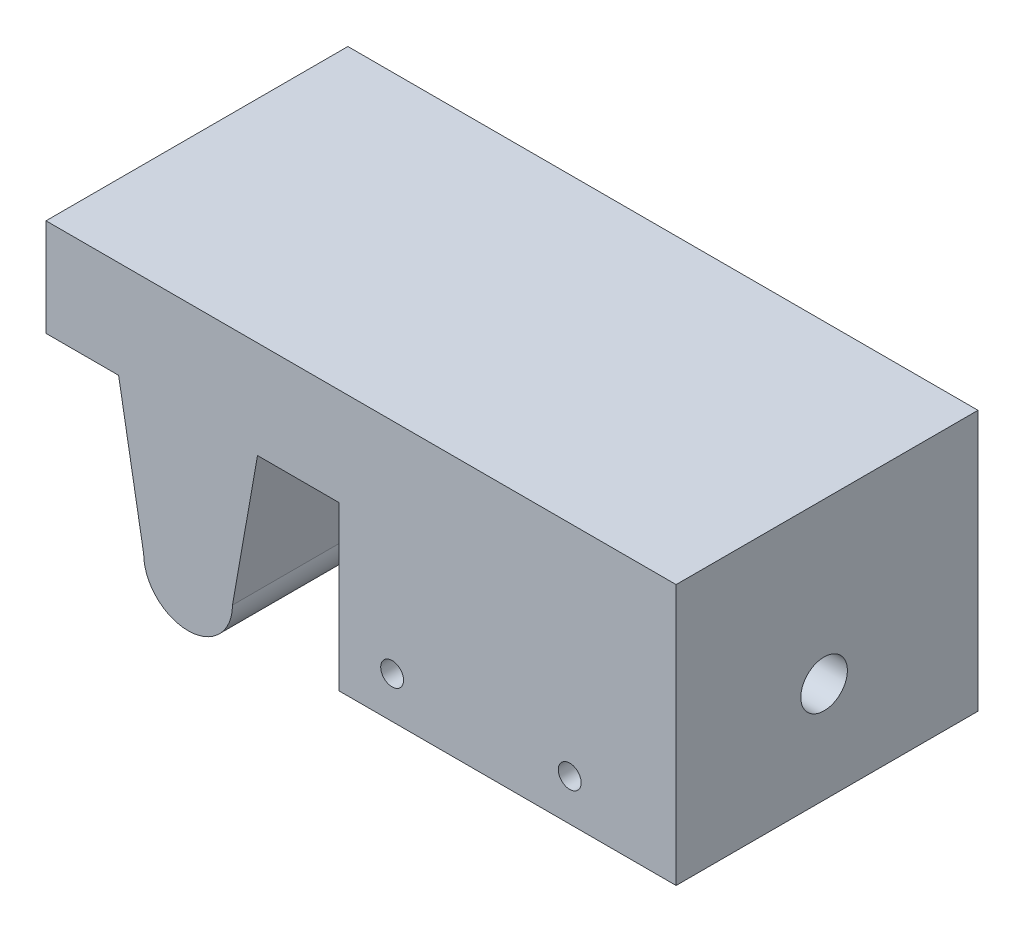
ISO-10303-21;
HEADER;
FILE_DESCRIPTION(('STEP AP214'),'2;1');
FILE_NAME('part.step','',(''),(''),'','','');
FILE_SCHEMA(('AUTOMOTIVE_DESIGN { 1 0 10303 214 1 1 1 1 }'));
ENDSEC;
DATA;
#1=APPLICATION_CONTEXT('core data for automotive mechanical design processes');
#2=APPLICATION_PROTOCOL_DEFINITION('international standard','automotive_design',2000,#1);
#3=PRODUCT_CONTEXT('',#1,'mechanical');
#4=PRODUCT('Part','Part','',(#3));
#5=PRODUCT_RELATED_PRODUCT_CATEGORY('part','',(#4));
#6=PRODUCT_DEFINITION_FORMATION('','',#4);
#7=PRODUCT_DEFINITION_CONTEXT('part definition',#1,'design');
#8=PRODUCT_DEFINITION('design','',#6,#7);
#9=PRODUCT_DEFINITION_SHAPE('','',#8);
#10=(LENGTH_UNIT() NAMED_UNIT(*) SI_UNIT(.MILLI.,.METRE.));
#11=(NAMED_UNIT(*) PLANE_ANGLE_UNIT() SI_UNIT($,.RADIAN.));
#12=(NAMED_UNIT(*) SI_UNIT($,.STERADIAN.) SOLID_ANGLE_UNIT());
#13=UNCERTAINTY_MEASURE_WITH_UNIT(LENGTH_MEASURE(1.E-05),#10,'distance_accuracy_value','');
#14=(GEOMETRIC_REPRESENTATION_CONTEXT(3) GLOBAL_UNCERTAINTY_ASSIGNED_CONTEXT((#13)) GLOBAL_UNIT_ASSIGNED_CONTEXT((#10,
#11,#12)) REPRESENTATION_CONTEXT('',''));
#15=CARTESIAN_POINT('',(0.,0.,0.));
#16=DIRECTION('',(0.,0.,1.));
#17=DIRECTION('',(1.,0.,0.));
#18=AXIS2_PLACEMENT_3D('',#15,#16,#17);
#19=CARTESIAN_POINT('',(48.,-5.616325,33.1917878));
#20=DIRECTION('',(0.,-1.,0.));
#21=DIRECTION('',(0.,0.,1.));
#22=AXIS2_PLACEMENT_3D('',#19,#20,#21);
#23=PLANE('',#22);
#24=DIRECTION('',(-1.,0.,0.));
#25=VECTOR('',#24,1.);
#26=CARTESIAN_POINT('',(12.2681524629967,-5.616325,55.1917878));
#27=LINE('',#26,#25);
#28=CARTESIAN_POINT('',(35.7318475370033,-5.616325,55.1917878));
#29=VERTEX_POINT('',#28);
#30=CARTESIAN_POINT('',(12.2681524629967,-5.616325,55.1917878));
#31=VERTEX_POINT('',#30);
#32=EDGE_CURVE('E155',#29,#31,#27,.T.);
#33=ORIENTED_EDGE('',*,*,#32,.T.);
#34=DIRECTION('',(0.,0.,-1.));
#35=VECTOR('',#34,1.);
#36=CARTESIAN_POINT('',(12.2681524629967,-5.616325,123.470216823141));
#37=LINE('',#36,#35);
#38=CARTESIAN_POINT('',(12.2681524629967,-5.616325,84.1917878));
#39=VERTEX_POINT('',#38);
#40=EDGE_CURVE('E151',#39,#31,#37,.T.);
#41=ORIENTED_EDGE('',*,*,#40,.F.);
#42=DIRECTION('',(1.,0.,0.));
#43=VECTOR('',#42,1.);
#44=CARTESIAN_POINT('',(-17.2191805697573,-5.616325,84.1917878));
#45=LINE('',#44,#43);
#46=CARTESIAN_POINT('',(0.,-5.616325,84.1917878));
#47=VERTEX_POINT('',#46);
#48=EDGE_CURVE('E190',#47,#39,#45,.T.);
#49=ORIENTED_EDGE('',*,*,#48,.F.);
#50=DIRECTION('',(0.,0.,1.));
#51=VECTOR('',#50,1.);
#52=CARTESIAN_POINT('',(0.,-5.616325,33.1917878));
#53=LINE('',#52,#51);
#54=CARTESIAN_POINT('',(0.,-5.616325,33.1917878));
#55=VERTEX_POINT('',#54);
#56=EDGE_CURVE('E56',#55,#47,#53,.T.);
#57=ORIENTED_EDGE('',*,*,#56,.F.);
#58=DIRECTION('',(-1.,0.,0.));
#59=VECTOR('',#58,1.);
#60=CARTESIAN_POINT('',(49.5,-5.616325,33.1917878));
#61=LINE('',#60,#59);
#62=CARTESIAN_POINT('',(49.5,-5.616325,33.1917878));
#63=VERTEX_POINT('',#62);
#64=EDGE_CURVE('E167',#63,#55,#61,.T.);
#65=ORIENTED_EDGE('',*,*,#64,.F.);
#66=DIRECTION('',(0.,0.,1.));
#67=VECTOR('',#66,1.);
#68=CARTESIAN_POINT('',(49.5,-5.616325,33.1917878));
#69=LINE('',#68,#67);
#70=CARTESIAN_POINT('',(49.5,-5.616325,84.1917878));
#71=VERTEX_POINT('',#70);
#72=EDGE_CURVE('E169',#63,#71,#69,.T.);
#73=ORIENTED_EDGE('',*,*,#72,.T.);
#74=CARTESIAN_POINT('',(35.7318475370033,-5.616325,84.1917878));
#75=VERTEX_POINT('',#74);
#76=EDGE_CURVE('E189',#75,#71,#45,.T.);
#77=ORIENTED_EDGE('',*,*,#76,.F.);
#78=DIRECTION('',(0.,0.,-1.));
#79=VECTOR('',#78,1.);
#80=CARTESIAN_POINT('',(35.7318475370033,-5.616325,123.470216823141));
#81=LINE('',#80,#79);
#82=EDGE_CURVE('E48',#75,#29,#81,.T.);
#83=ORIENTED_EDGE('',*,*,#82,.T.);
#84=EDGE_LOOP('',(#33,#41,#49,#57,#65,#73,#77,#83));
#85=FACE_BOUND('',#84,.T.);
#86=ADVANCED_FACE('F33',(#85),#23,.T.);
#87=CARTESIAN_POINT('',(0.,-8.166325,0.));
#88=DIRECTION('',(0.,1.,0.));
#89=DIRECTION('',(0.,0.,1.));
#90=AXIS2_PLACEMENT_3D('',#87,#88,#89);
#91=PLANE('',#90);
#92=DIRECTION('',(0.,0.,-1.));
#93=VECTOR('',#92,1.);
#94=CARTESIAN_POINT('',(49.5,-8.166325,-60.3469004731473));
#95=LINE('',#94,#93);
#96=CARTESIAN_POINT('',(49.5,-8.166325,76.1917878));
#97=VERTEX_POINT('',#96);
#98=CARTESIAN_POINT('',(49.5,-8.166325,33.1917878));
#99=VERTEX_POINT('',#98);
#100=EDGE_CURVE('E245',#97,#99,#95,.T.);
#101=ORIENTED_EDGE('',*,*,#100,.T.);
#102=DIRECTION('',(1.,0.,0.));
#103=VECTOR('',#102,1.);
#104=CARTESIAN_POINT('',(0.,-8.166325,33.1917878));
#105=LINE('',#104,#103);
#106=CARTESIAN_POINT('',(97.45,-8.166325,33.1917878));
#107=VERTEX_POINT('',#106);
#108=EDGE_CURVE('E186',#99,#107,#105,.T.);
#109=ORIENTED_EDGE('',*,*,#108,.T.);
#110=DIRECTION('',(0.,0.,-1.));
#111=VECTOR('',#110,1.);
#112=CARTESIAN_POINT('',(97.45,-8.166325,-9.80821219999999));
#113=LINE('',#112,#111);
#114=CARTESIAN_POINT('',(97.45,-8.166325,76.1917878));
#115=VERTEX_POINT('',#114);
#116=EDGE_CURVE('E232',#115,#107,#113,.T.);
#117=ORIENTED_EDGE('',*,*,#116,.F.);
#118=DIRECTION('',(-1.,0.,0.));
#119=VECTOR('',#118,1.);
#120=CARTESIAN_POINT('',(49.5,-8.166325,76.1917878));
#121=LINE('',#120,#119);
#122=EDGE_CURVE('E217',#115,#97,#121,.T.);
#123=ORIENTED_EDGE('',*,*,#122,.T.);
#124=EDGE_LOOP('',(#101,#109,#117,#123));
#125=FACE_BOUND('',#124,.T.);
#126=ADVANCED_FACE('F280',(#125),#91,.F.);
#127=CARTESIAN_POINT('',(0.,0.,10.));
#128=DIRECTION('',(1.,0.,0.));
#129=DIRECTION('',(0.,0.,-1.));
#130=AXIS2_PLACEMENT_3D('',#127,#128,#129);
#131=PLANE('',#130);
#132=DIRECTION('',(0.,1.,0.));
#133=VECTOR('',#132,1.);
#134=CARTESIAN_POINT('',(0.,10.8609375,33.1917878));
#135=LINE('',#134,#133);
#136=CARTESIAN_POINT('',(0.,10.8609375,33.1917878));
#137=VERTEX_POINT('',#136);
#138=EDGE_CURVE('E175',#55,#137,#135,.T.);
#139=ORIENTED_EDGE('',*,*,#138,.F.);
#140=ORIENTED_EDGE('',*,*,#56,.T.);
#141=DIRECTION('',(0.,1.,0.));
#142=VECTOR('',#141,1.);
#143=CARTESIAN_POINT('',(0.,10.8609375,84.1917878));
#144=LINE('',#143,#142);
#145=CARTESIAN_POINT('',(0.,10.8609375,84.1917878));
#146=VERTEX_POINT('',#145);
#147=EDGE_CURVE('E194',#47,#146,#144,.T.);
#148=ORIENTED_EDGE('',*,*,#147,.T.);
#149=DIRECTION('',(0.,0.,-1.));
#150=VECTOR('',#149,1.);
#151=CARTESIAN_POINT('',(0.,10.8609375,82.405200233796));
#152=LINE('',#151,#150);
#153=EDGE_CURVE('E242',#146,#137,#152,.T.);
#154=ORIENTED_EDGE('',*,*,#153,.T.);
#155=EDGE_LOOP('',(#139,#140,#148,#154));
#156=FACE_BOUND('',#155,.T.);
#157=ADVANCED_FACE('F35',(#156),#131,.F.);
#158=CARTESIAN_POINT('',(0.,10.8609375,82.405200233796));
#159=DIRECTION('',(0.,-1.,0.));
#160=DIRECTION('',(0.,0.,-1.));
#161=AXIS2_PLACEMENT_3D('',#158,#159,#160);
#162=PLANE('',#161);
#163=DIRECTION('',(0.,0.,1.));
#164=VECTOR('',#163,1.);
#165=CARTESIAN_POINT('',(106.45,10.8609375,33.1917878));
#166=LINE('',#165,#164);
#167=CARTESIAN_POINT('',(106.45,10.8609375,33.1917878));
#168=VERTEX_POINT('',#167);
#169=CARTESIAN_POINT('',(106.45,10.8609375,84.1917878));
#170=VERTEX_POINT('',#169);
#171=EDGE_CURVE('E238',#168,#170,#166,.T.);
#172=ORIENTED_EDGE('',*,*,#171,.F.);
#173=DIRECTION('',(-1.,0.,0.));
#174=VECTOR('',#173,1.);
#175=CARTESIAN_POINT('',(106.45,10.8609375,33.1917878));
#176=LINE('',#175,#174);
#177=EDGE_CURVE('E179',#168,#137,#176,.T.);
#178=ORIENTED_EDGE('',*,*,#177,.T.);
#179=ORIENTED_EDGE('',*,*,#153,.F.);
#180=DIRECTION('',(1.,0.,0.));
#181=VECTOR('',#180,1.);
#182=CARTESIAN_POINT('',(-17.2191805697573,10.8609375,84.1917878));
#183=LINE('',#182,#181);
#184=EDGE_CURVE('E203',#146,#170,#183,.T.);
#185=ORIENTED_EDGE('',*,*,#184,.T.);
#186=EDGE_LOOP('',(#172,#178,#179,#185));
#187=FACE_BOUND('',#186,.T.);
#188=ADVANCED_FACE('F264',(#187),#162,.F.);
#189=CARTESIAN_POINT('',(106.45,0.,0.));
#190=DIRECTION('',(-1.,0.,0.));
#191=DIRECTION('',(0.,0.,1.));
#192=AXIS2_PLACEMENT_3D('',#189,#190,#191);
#193=PLANE('',#192);
#194=CARTESIAN_POINT('',(106.45,-16.166325,59.1917878));
#195=DIRECTION('',(-1.,0.,0.));
#196=DIRECTION('',(0.,0.,1.));
#197=AXIS2_PLACEMENT_3D('',#194,#195,#196);
#198=CIRCLE('',#197,3.93700000000001);
#199=CARTESIAN_POINT('',(106.45,-16.166325,63.1287878));
#200=VERTEX_POINT('',#199);
#201=EDGE_CURVE('E142',#200,#200,#198,.T.);
#202=ORIENTED_EDGE('',*,*,#201,.T.);
#203=EDGE_LOOP('',(#202));
#204=FACE_BOUND('',#203,.T.);
#205=DIRECTION('',(0.,0.,1.));
#206=VECTOR('',#205,1.);
#207=CARTESIAN_POINT('',(106.45,-33.166325,-17.8082122));
#208=LINE('',#207,#206);
#209=CARTESIAN_POINT('',(106.45,-33.166325,33.1917878));
#210=VERTEX_POINT('',#209);
#211=CARTESIAN_POINT('',(106.45,-33.166325,84.1917878));
#212=VERTEX_POINT('',#211);
#213=EDGE_CURVE('E233',#210,#212,#208,.T.);
#214=ORIENTED_EDGE('',*,*,#213,.F.);
#215=DIRECTION('',(0.,1.,0.));
#216=VECTOR('',#215,1.);
#217=CARTESIAN_POINT('',(106.45,10.8609375,33.1917878));
#218=LINE('',#217,#216);
#219=EDGE_CURVE('E176',#210,#168,#218,.T.);
#220=ORIENTED_EDGE('',*,*,#219,.T.);
#221=ORIENTED_EDGE('',*,*,#171,.T.);
#222=DIRECTION('',(0.,1.,0.));
#223=VECTOR('',#222,1.);
#224=CARTESIAN_POINT('',(106.45,-8.166325,84.1917878));
#225=LINE('',#224,#223);
#226=EDGE_CURVE('E206',#212,#170,#225,.T.);
#227=ORIENTED_EDGE('',*,*,#226,.F.);
#228=EDGE_LOOP('',(#214,#220,#221,#227));
#229=FACE_BOUND('',#228,.T.);
#230=ADVANCED_FACE('F256',(#204,#229),#193,.F.);
#231=CARTESIAN_POINT('',(97.45,-33.166325,-9.80821219999999));
#232=DIRECTION('',(1.,0.,0.));
#233=DIRECTION('',(0.,0.,-1.));
#234=AXIS2_PLACEMENT_3D('',#231,#232,#233);
#235=PLANE('',#234);
#236=CARTESIAN_POINT('',(97.45,-16.166325,59.1917878));
#237=DIRECTION('',(-1.,0.,0.));
#238=DIRECTION('',(0.,0.,1.));
#239=AXIS2_PLACEMENT_3D('',#236,#237,#238);
#240=CIRCLE('',#239,3.93700000000001);
#241=CARTESIAN_POINT('',(97.45,-16.166325,63.1287878));
#242=VERTEX_POINT('',#241);
#243=EDGE_CURVE('E305',#242,#242,#240,.T.);
#244=ORIENTED_EDGE('',*,*,#243,.F.);
#245=EDGE_LOOP('',(#244));
#246=FACE_BOUND('',#245,.T.);
#247=ORIENTED_EDGE('',*,*,#116,.T.);
#248=DIRECTION('',(0.,-1.,0.));
#249=VECTOR('',#248,1.);
#250=CARTESIAN_POINT('',(97.45,-33.166325,33.1917878));
#251=LINE('',#250,#249);
#252=CARTESIAN_POINT('',(97.45,-33.166325,33.1917878));
#253=VERTEX_POINT('',#252);
#254=EDGE_CURVE('E183',#107,#253,#251,.T.);
#255=ORIENTED_EDGE('',*,*,#254,.T.);
#256=DIRECTION('',(0.,0.,-1.));
#257=VECTOR('',#256,1.);
#258=CARTESIAN_POINT('',(97.45,-33.166325,-9.80821219999999));
#259=LINE('',#258,#257);
#260=CARTESIAN_POINT('',(97.45,-33.166325,76.1917878));
#261=VERTEX_POINT('',#260);
#262=EDGE_CURVE('E235',#261,#253,#259,.T.);
#263=ORIENTED_EDGE('',*,*,#262,.F.);
#264=DIRECTION('',(0.,1.,0.));
#265=VECTOR('',#264,1.);
#266=CARTESIAN_POINT('',(97.45,-33.166325,76.1917878));
#267=LINE('',#266,#265);
#268=EDGE_CURVE('E229',#261,#115,#267,.T.);
#269=ORIENTED_EDGE('',*,*,#268,.T.);
#270=EDGE_LOOP('',(#247,#255,#263,#269));
#271=FACE_BOUND('',#270,.T.);
#272=ADVANCED_FACE('F276',(#246,#271),#235,.F.);
#273=CARTESIAN_POINT('',(0.,-33.166325,0.));
#274=DIRECTION('',(0.,1.,0.));
#275=DIRECTION('',(0.,0.,1.));
#276=AXIS2_PLACEMENT_3D('',#273,#274,#275);
#277=PLANE('',#276);
#278=ORIENTED_EDGE('',*,*,#262,.T.);
#279=DIRECTION('',(1.,0.,0.));
#280=VECTOR('',#279,1.);
#281=CARTESIAN_POINT('',(0.,-33.166325,33.1917878));
#282=LINE('',#281,#280);
#283=EDGE_CURVE('E41',#253,#210,#282,.T.);
#284=ORIENTED_EDGE('',*,*,#283,.T.);
#285=ORIENTED_EDGE('',*,*,#213,.T.);
#286=DIRECTION('',(1.,0.,0.));
#287=VECTOR('',#286,1.);
#288=CARTESIAN_POINT('',(49.5,-33.166325,84.1917878));
#289=LINE('',#288,#287);
#290=CARTESIAN_POINT('',(49.5,-33.166325,84.1917878));
#291=VERTEX_POINT('',#290);
#292=EDGE_CURVE('E209',#291,#212,#289,.T.);
#293=ORIENTED_EDGE('',*,*,#292,.F.);
#294=DIRECTION('',(0.,0.,1.));
#295=VECTOR('',#294,1.);
#296=CARTESIAN_POINT('',(49.5,-33.166325,84.1917878));
#297=LINE('',#296,#295);
#298=CARTESIAN_POINT('',(49.5,-33.166325,76.1917878));
#299=VERTEX_POINT('',#298);
#300=EDGE_CURVE('E215',#299,#291,#297,.T.);
#301=ORIENTED_EDGE('',*,*,#300,.F.);
#302=DIRECTION('',(-1.,0.,0.));
#303=VECTOR('',#302,1.);
#304=CARTESIAN_POINT('',(49.5,-33.166325,76.1917878));
#305=LINE('',#304,#303);
#306=EDGE_CURVE('E226',#261,#299,#305,.T.);
#307=ORIENTED_EDGE('',*,*,#306,.F.);
#308=EDGE_LOOP('',(#278,#284,#285,#293,#301,#307));
#309=FACE_BOUND('',#308,.T.);
#310=ADVANCED_FACE('F250',(#309),#277,.F.);
#311=CARTESIAN_POINT('',(88.475,-26.166325,84.1917878));
#312=DIRECTION('',(0.,0.,-1.));
#313=DIRECTION('',(1.,0.,0.));
#314=AXIS2_PLACEMENT_3D('',#311,#312,#313);
#315=CYLINDRICAL_SURFACE('',#314,1.9304);
#316=CARTESIAN_POINT('',(88.475,-26.166325,84.1917878));
#317=DIRECTION('',(0.,0.,1.));
#318=DIRECTION('',(1.,0.,0.));
#319=AXIS2_PLACEMENT_3D('',#316,#317,#318);
#320=CIRCLE('',#319,1.9304);
#321=CARTESIAN_POINT('',(90.4054,-26.166325,84.1917878));
#322=VERTEX_POINT('',#321);
#323=EDGE_CURVE('E200',#322,#322,#320,.T.);
#324=ORIENTED_EDGE('',*,*,#323,.T.);
#325=EDGE_LOOP('',(#324));
#326=FACE_BOUND('',#325,.T.);
#327=CARTESIAN_POINT('',(88.475,-26.166325,76.1917878));
#328=DIRECTION('',(0.,0.,1.));
#329=DIRECTION('',(1.,0.,0.));
#330=AXIS2_PLACEMENT_3D('',#327,#328,#329);
#331=CIRCLE('',#330,1.9304);
#332=CARTESIAN_POINT('',(90.4054,-26.166325,76.1917878));
#333=VERTEX_POINT('',#332);
#334=EDGE_CURVE('E223',#333,#333,#331,.T.);
#335=ORIENTED_EDGE('',*,*,#334,.F.);
#336=EDGE_LOOP('',(#335));
#337=FACE_BOUND('',#336,.T.);
#338=ADVANCED_FACE('F338',(#326,#337),#315,.F.);
#339=CARTESIAN_POINT('',(58.475,-26.166325,84.1917878));
#340=DIRECTION('',(0.,0.,-1.));
#341=DIRECTION('',(1.,0.,0.));
#342=AXIS2_PLACEMENT_3D('',#339,#340,#341);
#343=CYLINDRICAL_SURFACE('',#342,1.9304);
#344=CARTESIAN_POINT('',(58.475,-26.166325,84.1917878));
#345=DIRECTION('',(0.,0.,1.));
#346=DIRECTION('',(1.,0.,0.));
#347=AXIS2_PLACEMENT_3D('',#344,#345,#346);
#348=CIRCLE('',#347,1.9304);
#349=CARTESIAN_POINT('',(60.4054,-26.166325,84.1917878));
#350=VERTEX_POINT('',#349);
#351=EDGE_CURVE('E197',#350,#350,#348,.T.);
#352=ORIENTED_EDGE('',*,*,#351,.T.);
#353=EDGE_LOOP('',(#352));
#354=FACE_BOUND('',#353,.T.);
#355=CARTESIAN_POINT('',(58.475,-26.166325,76.1917878));
#356=DIRECTION('',(0.,0.,1.));
#357=DIRECTION('',(1.,0.,0.));
#358=AXIS2_PLACEMENT_3D('',#355,#356,#357);
#359=CIRCLE('',#358,1.9304);
#360=CARTESIAN_POINT('',(60.4054,-26.166325,76.1917878));
#361=VERTEX_POINT('',#360);
#362=EDGE_CURVE('E220',#361,#361,#359,.T.);
#363=ORIENTED_EDGE('',*,*,#362,.F.);
#364=EDGE_LOOP('',(#363));
#365=FACE_BOUND('',#364,.T.);
#366=ADVANCED_FACE('F334',(#354,#365),#343,.F.);
#367=CARTESIAN_POINT('',(49.5,-33.166325,76.1917878));
#368=DIRECTION('',(0.,0.,1.));
#369=DIRECTION('',(-1.,0.,0.));
#370=AXIS2_PLACEMENT_3D('',#367,#368,#369);
#371=PLANE('',#370);
#372=ORIENTED_EDGE('',*,*,#362,.T.);
#373=EDGE_LOOP('',(#372));
#374=FACE_BOUND('',#373,.T.);
#375=ORIENTED_EDGE('',*,*,#334,.T.);
#376=EDGE_LOOP('',(#375));
#377=FACE_BOUND('',#376,.T.);
#378=ORIENTED_EDGE('',*,*,#122,.F.);
#379=ORIENTED_EDGE('',*,*,#268,.F.);
#380=ORIENTED_EDGE('',*,*,#306,.T.);
#381=DIRECTION('',(0.,1.,0.));
#382=VECTOR('',#381,1.);
#383=CARTESIAN_POINT('',(49.5,-33.166325,76.1917878));
#384=LINE('',#383,#382);
#385=EDGE_CURVE('E212',#299,#97,#384,.T.);
#386=ORIENTED_EDGE('',*,*,#385,.T.);
#387=EDGE_LOOP('',(#378,#379,#380,#386));
#388=FACE_BOUND('',#387,.T.);
#389=ADVANCED_FACE('F274',(#374,#377,#388),#371,.F.);
#390=CARTESIAN_POINT('',(-17.2191805697573,10.8609375,84.1917878));
#391=DIRECTION('',(0.,0.,-1.));
#392=DIRECTION('',(0.,-1.,0.));
#393=AXIS2_PLACEMENT_3D('',#390,#391,#392);
#394=PLANE('',#393);
#395=ORIENTED_EDGE('',*,*,#351,.F.);
#396=EDGE_LOOP('',(#395));
#397=FACE_BOUND('',#396,.T.);
#398=ORIENTED_EDGE('',*,*,#323,.F.);
#399=EDGE_LOOP('',(#398));
#400=FACE_BOUND('',#399,.T.);
#401=ORIENTED_EDGE('',*,*,#48,.T.);
#402=DIRECTION('',(-0.173648177666935,0.984807753012207,0.));
#403=VECTOR('',#402,1.);
#404=CARTESIAN_POINT('',(16.5,-29.616325,84.1917878));
#405=LINE('',#404,#403);
#406=CARTESIAN_POINT('',(16.5,-29.616325,84.1917878));
#407=VERTEX_POINT('',#406);
#408=EDGE_CURVE('E164',#407,#39,#405,.T.);
#409=ORIENTED_EDGE('',*,*,#408,.F.);
#410=CARTESIAN_POINT('',(24.,-29.616325,84.1917878));
#411=DIRECTION('',(0.,0.,-1.));
#412=DIRECTION('',(0.,1.,0.));
#413=AXIS2_PLACEMENT_3D('',#410,#411,#412);
#414=CIRCLE('',#413,7.5);
#415=CARTESIAN_POINT('',(31.5,-29.616325,84.1917878));
#416=VERTEX_POINT('',#415);
#417=EDGE_CURVE('E149',#416,#407,#414,.T.);
#418=ORIENTED_EDGE('',*,*,#417,.F.);
#419=DIRECTION('',(-0.173648177666935,-0.984807753012207,0.));
#420=VECTOR('',#419,1.);
#421=CARTESIAN_POINT('',(31.5,-29.616325,84.1917878));
#422=LINE('',#421,#420);
#423=EDGE_CURVE('E166',#75,#416,#422,.T.);
#424=ORIENTED_EDGE('',*,*,#423,.F.);
#425=ORIENTED_EDGE('',*,*,#76,.T.);
#426=DIRECTION('',(0.,1.,0.));
#427=VECTOR('',#426,1.);
#428=CARTESIAN_POINT('',(49.5,-47.916325,84.1917878));
#429=LINE('',#428,#427);
#430=EDGE_CURVE('E170',#291,#71,#429,.T.);
#431=ORIENTED_EDGE('',*,*,#430,.F.);
#432=ORIENTED_EDGE('',*,*,#292,.T.);
#433=ORIENTED_EDGE('',*,*,#226,.T.);
#434=ORIENTED_EDGE('',*,*,#184,.F.);
#435=ORIENTED_EDGE('',*,*,#147,.F.);
#436=EDGE_LOOP('',(#401,#409,#418,#424,#425,#431,#432,#433,#434,#435));
#437=FACE_BOUND('',#436,.T.);
#438=ADVANCED_FACE('F260',(#397,#400,#437),#394,.F.);
#439=CARTESIAN_POINT('',(106.45,10.8609375,33.1917878));
#440=DIRECTION('',(0.,0.,1.));
#441=DIRECTION('',(1.,0.,0.));
#442=AXIS2_PLACEMENT_3D('',#439,#440,#441);
#443=PLANE('',#442);
#444=ORIENTED_EDGE('',*,*,#108,.F.);
#445=DIRECTION('',(0.,1.,0.));
#446=VECTOR('',#445,1.);
#447=CARTESIAN_POINT('',(49.5,10.8609375,33.1917878));
#448=LINE('',#447,#446);
#449=EDGE_CURVE('E11',#99,#63,#448,.T.);
#450=ORIENTED_EDGE('',*,*,#449,.T.);
#451=ORIENTED_EDGE('',*,*,#64,.T.);
#452=ORIENTED_EDGE('',*,*,#138,.T.);
#453=ORIENTED_EDGE('',*,*,#177,.F.);
#454=ORIENTED_EDGE('',*,*,#219,.F.);
#455=ORIENTED_EDGE('',*,*,#283,.F.);
#456=ORIENTED_EDGE('',*,*,#254,.F.);
#457=EDGE_LOOP('',(#444,#450,#451,#452,#453,#454,#455,#456));
#458=FACE_BOUND('',#457,.T.);
#459=ADVANCED_FACE('F278',(#458),#443,.F.);
#460=CARTESIAN_POINT('',(49.5,-47.916325,33.1917878));
#461=DIRECTION('',(1.,0.,0.));
#462=DIRECTION('',(0.,0.,-1.));
#463=AXIS2_PLACEMENT_3D('',#460,#461,#462);
#464=PLANE('',#463);
#465=ORIENTED_EDGE('',*,*,#385,.F.);
#466=ORIENTED_EDGE('',*,*,#300,.T.);
#467=ORIENTED_EDGE('',*,*,#430,.T.);
#468=ORIENTED_EDGE('',*,*,#72,.F.);
#469=ORIENTED_EDGE('',*,*,#449,.F.);
#470=ORIENTED_EDGE('',*,*,#100,.F.);
#471=EDGE_LOOP('',(#465,#466,#467,#468,#469,#470));
#472=FACE_BOUND('',#471,.T.);
#473=ADVANCED_FACE('F269',(#472),#464,.F.);
#474=CARTESIAN_POINT('',(24.,-29.616325,55.1917878));
#475=DIRECTION('',(0.,0.,1.));
#476=DIRECTION('',(1.,0.,0.));
#477=AXIS2_PLACEMENT_3D('',#474,#475,#476);
#478=PLANE('',#477);
#479=DIRECTION('',(0.173648177666935,0.984807753012207,0.));
#480=VECTOR('',#479,1.);
#481=CARTESIAN_POINT('',(31.5,-29.616325,55.1917878));
#482=LINE('',#481,#480);
#483=CARTESIAN_POINT('',(31.5,-29.616325,55.1917878));
#484=VERTEX_POINT('',#483);
#485=EDGE_CURVE('E137',#484,#29,#482,.T.);
#486=ORIENTED_EDGE('',*,*,#485,.F.);
#487=CARTESIAN_POINT('',(24.,-29.616325,55.1917878));
#488=DIRECTION('',(0.,0.,1.));
#489=DIRECTION('',(1.,0.,0.));
#490=AXIS2_PLACEMENT_3D('',#487,#488,#489);
#491=CIRCLE('',#490,7.5);
#492=CARTESIAN_POINT('',(16.5,-29.616325,55.1917878));
#493=VERTEX_POINT('',#492);
#494=EDGE_CURVE('E130',#484,#493,#491,.T.);
#495=ORIENTED_EDGE('',*,*,#494,.T.);
#496=DIRECTION('',(0.173648177666935,-0.984807753012207,0.));
#497=VECTOR('',#496,1.);
#498=CARTESIAN_POINT('',(16.5,-29.616325,55.1917878));
#499=LINE('',#498,#497);
#500=EDGE_CURVE('E135',#31,#493,#499,.T.);
#501=ORIENTED_EDGE('',*,*,#500,.F.);
#502=ORIENTED_EDGE('',*,*,#32,.F.);
#503=EDGE_LOOP('',(#486,#495,#501,#502));
#504=FACE_BOUND('',#503,.T.);
#505=ADVANCED_FACE('F132',(#504),#478,.F.);
#506=CARTESIAN_POINT('',(16.5,-29.616325,123.470216823141));
#507=DIRECTION('',(0.984807753012207,0.173648177666935,0.));
#508=DIRECTION('',(-0.173648177666935,0.984807753012207,0.));
#509=AXIS2_PLACEMENT_3D('',#506,#507,#508);
#510=PLANE('',#509);
#511=DIRECTION('',(0.,0.,-1.));
#512=VECTOR('',#511,1.);
#513=CARTESIAN_POINT('',(16.5,-29.616325,123.470216823141));
#514=LINE('',#513,#512);
#515=EDGE_CURVE('E146',#407,#493,#514,.T.);
#516=ORIENTED_EDGE('',*,*,#515,.F.);
#517=ORIENTED_EDGE('',*,*,#408,.T.);
#518=ORIENTED_EDGE('',*,*,#40,.T.);
#519=ORIENTED_EDGE('',*,*,#500,.T.);
#520=EDGE_LOOP('',(#516,#517,#518,#519));
#521=FACE_BOUND('',#520,.T.);
#522=ADVANCED_FACE('F153',(#521),#510,.F.);
#523=CARTESIAN_POINT('',(31.5,-29.616325,123.470216823141));
#524=DIRECTION('',(-0.984807753012207,0.173648177666935,0.));
#525=DIRECTION('',(-0.173648177666935,-0.984807753012207,0.));
#526=AXIS2_PLACEMENT_3D('',#523,#524,#525);
#527=PLANE('',#526);
#528=ORIENTED_EDGE('',*,*,#82,.F.);
#529=ORIENTED_EDGE('',*,*,#423,.T.);
#530=DIRECTION('',(0.,0.,-1.));
#531=VECTOR('',#530,1.);
#532=CARTESIAN_POINT('',(31.5,-29.616325,123.470216823141));
#533=LINE('',#532,#531);
#534=EDGE_CURVE('E162',#416,#484,#533,.T.);
#535=ORIENTED_EDGE('',*,*,#534,.T.);
#536=ORIENTED_EDGE('',*,*,#485,.T.);
#537=EDGE_LOOP('',(#528,#529,#535,#536));
#538=FACE_BOUND('',#537,.T.);
#539=ADVANCED_FACE('F313',(#538),#527,.F.);
#540=CARTESIAN_POINT('',(24.,-29.616325,123.470216823141));
#541=DIRECTION('',(0.,0.,-1.));
#542=DIRECTION('',(-1.,0.,0.));
#543=AXIS2_PLACEMENT_3D('',#540,#541,#542);
#544=CYLINDRICAL_SURFACE('',#543,7.5);
#545=ORIENTED_EDGE('',*,*,#534,.F.);
#546=ORIENTED_EDGE('',*,*,#417,.T.);
#547=ORIENTED_EDGE('',*,*,#515,.T.);
#548=ORIENTED_EDGE('',*,*,#494,.F.);
#549=EDGE_LOOP('',(#545,#546,#547,#548));
#550=FACE_BOUND('',#549,.T.);
#551=CARTESIAN_POINT('',(24.,-29.616325,10.1917878));
#552=DIRECTION('',(0.,0.,1.));
#553=DIRECTION('',(1.,0.,0.));
#554=AXIS2_PLACEMENT_3D('',#551,#552,#553);
#555=CIRCLE('',#554,7.5);
#556=CARTESIAN_POINT('',(31.5,-29.616325,10.1917878));
#557=VERTEX_POINT('',#556);
#558=EDGE_CURVE('E141',#557,#557,#555,.T.);
#559=ORIENTED_EDGE('',*,*,#558,.T.);
#560=EDGE_LOOP('',(#559));
#561=FACE_BOUND('',#560,.T.);
#562=ADVANCED_FACE('F147',(#550,#561),#544,.T.);
#563=CARTESIAN_POINT('',(24.,-29.616325,10.1917878));
#564=DIRECTION('',(0.,0.,1.));
#565=DIRECTION('',(1.,0.,0.));
#566=AXIS2_PLACEMENT_3D('',#563,#564,#565);
#567=PLANE('',#566);
#568=ORIENTED_EDGE('',*,*,#558,.F.);
#569=EDGE_LOOP('',(#568));
#570=FACE_BOUND('',#569,.T.);
#571=ADVANCED_FACE('F320',(#570),#567,.F.);
#572=CARTESIAN_POINT('',(106.45,-16.166325,59.1917878));
#573=DIRECTION('',(-1.,0.,0.));
#574=DIRECTION('',(0.,0.,1.));
#575=AXIS2_PLACEMENT_3D('',#572,#573,#574);
#576=CYLINDRICAL_SURFACE('',#575,3.93700000000001);
#577=ORIENTED_EDGE('',*,*,#201,.F.);
#578=EDGE_LOOP('',(#577));
#579=FACE_BOUND('',#578,.T.);
#580=ORIENTED_EDGE('',*,*,#243,.T.);
#581=EDGE_LOOP('',(#580));
#582=FACE_BOUND('',#581,.T.);
#583=ADVANCED_FACE('F410',(#579,#582),#576,.F.);
#584=CLOSED_SHELL('',(#86,#126,#157,#188,#230,#272,#310,#338,#366,#389,#438,#459,#473,#505,#522,
#539,#562,#571,#583));
#585=MANIFOLD_SOLID_BREP('B2',#584);
#586=ADVANCED_BREP_SHAPE_REPRESENTATION('',(#18,#585),#14);
#587=SHAPE_DEFINITION_REPRESENTATION(#9,#586);
ENDSEC;
END-ISO-10303-21;
